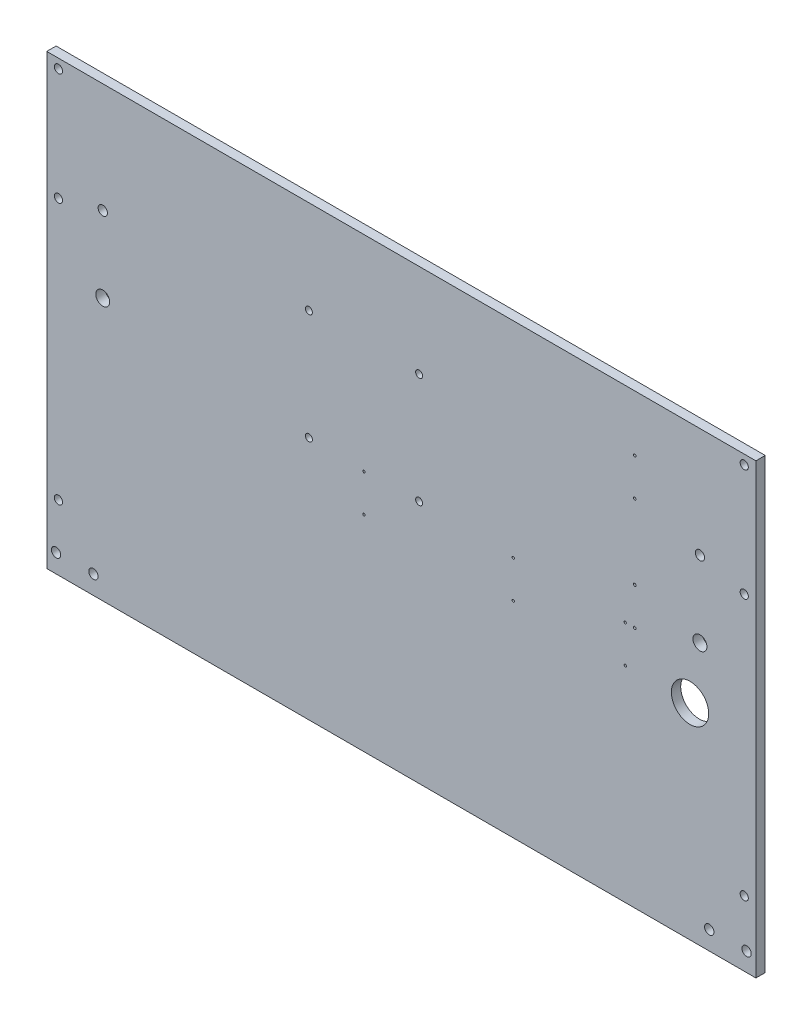
ISO-10303-21;
HEADER;
FILE_DESCRIPTION(('STEP AP214'),'2;1');
FILE_NAME('part.step','',(''),(''),'','','');
FILE_SCHEMA(('AUTOMOTIVE_DESIGN { 1 0 10303 214 1 1 1 1 }'));
ENDSEC;
DATA;
#1=APPLICATION_CONTEXT('core data for automotive mechanical design processes');
#2=APPLICATION_PROTOCOL_DEFINITION('international standard','automotive_design',2000,#1);
#3=PRODUCT_CONTEXT('',#1,'mechanical');
#4=PRODUCT('Part','Part','',(#3));
#5=PRODUCT_RELATED_PRODUCT_CATEGORY('part','',(#4));
#6=PRODUCT_DEFINITION_FORMATION('','',#4);
#7=PRODUCT_DEFINITION_CONTEXT('part definition',#1,'design');
#8=PRODUCT_DEFINITION('design','',#6,#7);
#9=PRODUCT_DEFINITION_SHAPE('','',#8);
#10=(LENGTH_UNIT() NAMED_UNIT(*) SI_UNIT(.MILLI.,.METRE.));
#11=(NAMED_UNIT(*) PLANE_ANGLE_UNIT() SI_UNIT($,.RADIAN.));
#12=(NAMED_UNIT(*) SI_UNIT($,.STERADIAN.) SOLID_ANGLE_UNIT());
#13=UNCERTAINTY_MEASURE_WITH_UNIT(LENGTH_MEASURE(1.E-05),#10,'distance_accuracy_value','');
#14=(GEOMETRIC_REPRESENTATION_CONTEXT(3) GLOBAL_UNCERTAINTY_ASSIGNED_CONTEXT((#13)) GLOBAL_UNIT_ASSIGNED_CONTEXT((#10,
#11,#12)) REPRESENTATION_CONTEXT('',''));
#15=CARTESIAN_POINT('',(0.,0.,0.));
#16=DIRECTION('',(0.,0.,1.));
#17=DIRECTION('',(1.,0.,0.));
#18=AXIS2_PLACEMENT_3D('',#15,#16,#17);
#19=CARTESIAN_POINT('',(241.3,-152.4,6.35));
#20=DIRECTION('',(-1.,0.,0.));
#21=DIRECTION('',(0.,0.,1.));
#22=AXIS2_PLACEMENT_3D('',#19,#20,#21);
#23=PLANE('',#22);
#24=DIRECTION('',(0.,1.,0.));
#25=VECTOR('',#24,1.);
#26=CARTESIAN_POINT('',(241.3,-152.4,0.));
#27=LINE('',#26,#25);
#28=CARTESIAN_POINT('',(241.3,-152.4,0.));
#29=VERTEX_POINT('',#28);
#30=CARTESIAN_POINT('',(241.3,152.4,0.));
#31=VERTEX_POINT('',#30);
#32=EDGE_CURVE('E115',#29,#31,#27,.T.);
#33=ORIENTED_EDGE('',*,*,#32,.T.);
#34=DIRECTION('',(0.,0.,-1.));
#35=VECTOR('',#34,1.);
#36=CARTESIAN_POINT('',(241.3,152.4,6.35));
#37=LINE('',#36,#35);
#38=CARTESIAN_POINT('',(241.3,152.4,6.35));
#39=VERTEX_POINT('',#38);
#40=EDGE_CURVE('E11',#39,#31,#37,.T.);
#41=ORIENTED_EDGE('',*,*,#40,.F.);
#42=DIRECTION('',(0.,1.,0.));
#43=VECTOR('',#42,1.);
#44=CARTESIAN_POINT('',(241.3,-152.4,6.35));
#45=LINE('',#44,#43);
#46=CARTESIAN_POINT('',(241.3,-152.4,6.35));
#47=VERTEX_POINT('',#46);
#48=EDGE_CURVE('E97',#47,#39,#45,.T.);
#49=ORIENTED_EDGE('',*,*,#48,.F.);
#50=DIRECTION('',(0.,0.,-1.));
#51=VECTOR('',#50,1.);
#52=CARTESIAN_POINT('',(241.3,-152.4,6.35));
#53=LINE('',#52,#51);
#54=EDGE_CURVE('E111',#47,#29,#53,.T.);
#55=ORIENTED_EDGE('',*,*,#54,.T.);
#56=EDGE_LOOP('',(#33,#41,#49,#55));
#57=FACE_BOUND('',#56,.T.);
#58=ADVANCED_FACE('F45',(#57),#23,.F.);
#59=CARTESIAN_POINT('',(-241.3,152.4,6.35));
#60=DIRECTION('',(0.,-1.,0.));
#61=DIRECTION('',(0.,0.,-1.));
#62=AXIS2_PLACEMENT_3D('',#59,#60,#61);
#63=PLANE('',#62);
#64=DIRECTION('',(-1.,0.,0.));
#65=VECTOR('',#64,1.);
#66=CARTESIAN_POINT('',(-241.3,152.4,0.));
#67=LINE('',#66,#65);
#68=CARTESIAN_POINT('',(-241.3,152.4,0.));
#69=VERTEX_POINT('',#68);
#70=EDGE_CURVE('E102',#31,#69,#67,.T.);
#71=ORIENTED_EDGE('',*,*,#70,.T.);
#72=DIRECTION('',(0.,0.,-1.));
#73=VECTOR('',#72,1.);
#74=CARTESIAN_POINT('',(-241.3,152.4,6.35));
#75=LINE('',#74,#73);
#76=CARTESIAN_POINT('',(-241.3,152.4,6.35));
#77=VERTEX_POINT('',#76);
#78=EDGE_CURVE('E54',#77,#69,#75,.T.);
#79=ORIENTED_EDGE('',*,*,#78,.F.);
#80=DIRECTION('',(-1.,0.,0.));
#81=VECTOR('',#80,1.);
#82=CARTESIAN_POINT('',(-241.3,152.4,6.35));
#83=LINE('',#82,#81);
#84=EDGE_CURVE('E92',#39,#77,#83,.T.);
#85=ORIENTED_EDGE('',*,*,#84,.F.);
#86=ORIENTED_EDGE('',*,*,#40,.T.);
#87=EDGE_LOOP('',(#71,#79,#85,#86));
#88=FACE_BOUND('',#87,.T.);
#89=ADVANCED_FACE('F101',(#88),#63,.F.);
#90=CARTESIAN_POINT('',(-241.3,-152.4,6.35));
#91=DIRECTION('',(1.,0.,0.));
#92=DIRECTION('',(0.,0.,-1.));
#93=AXIS2_PLACEMENT_3D('',#90,#91,#92);
#94=PLANE('',#93);
#95=DIRECTION('',(0.,-1.,0.));
#96=VECTOR('',#95,1.);
#97=CARTESIAN_POINT('',(-241.3,-152.4,0.));
#98=LINE('',#97,#96);
#99=CARTESIAN_POINT('',(-241.3,-152.4,0.));
#100=VERTEX_POINT('',#99);
#101=EDGE_CURVE('E79',#69,#100,#98,.T.);
#102=ORIENTED_EDGE('',*,*,#101,.T.);
#103=DIRECTION('',(0.,0.,-1.));
#104=VECTOR('',#103,1.);
#105=CARTESIAN_POINT('',(-241.3,-152.4,6.35));
#106=LINE('',#105,#104);
#107=CARTESIAN_POINT('',(-241.3,-152.4,6.35));
#108=VERTEX_POINT('',#107);
#109=EDGE_CURVE('E104',#108,#100,#106,.T.);
#110=ORIENTED_EDGE('',*,*,#109,.F.);
#111=DIRECTION('',(0.,-1.,0.));
#112=VECTOR('',#111,1.);
#113=CARTESIAN_POINT('',(-241.3,-152.4,6.35));
#114=LINE('',#113,#112);
#115=EDGE_CURVE('E95',#77,#108,#114,.T.);
#116=ORIENTED_EDGE('',*,*,#115,.F.);
#117=ORIENTED_EDGE('',*,*,#78,.T.);
#118=EDGE_LOOP('',(#102,#110,#116,#117));
#119=FACE_BOUND('',#118,.T.);
#120=ADVANCED_FACE('F105',(#119),#94,.F.);
#121=CARTESIAN_POINT('',(-241.3,-152.4,6.35));
#122=DIRECTION('',(0.,1.,0.));
#123=DIRECTION('',(0.,0.,1.));
#124=AXIS2_PLACEMENT_3D('',#121,#122,#123);
#125=PLANE('',#124);
#126=DIRECTION('',(1.,0.,0.));
#127=VECTOR('',#126,1.);
#128=CARTESIAN_POINT('',(-241.3,-152.4,0.));
#129=LINE('',#128,#127);
#130=EDGE_CURVE('E85',#100,#29,#129,.T.);
#131=ORIENTED_EDGE('',*,*,#130,.T.);
#132=ORIENTED_EDGE('',*,*,#54,.F.);
#133=DIRECTION('',(1.,0.,0.));
#134=VECTOR('',#133,1.);
#135=CARTESIAN_POINT('',(-241.3,-152.4,6.35));
#136=LINE('',#135,#134);
#137=EDGE_CURVE('E62',#108,#47,#136,.T.);
#138=ORIENTED_EDGE('',*,*,#137,.F.);
#139=ORIENTED_EDGE('',*,*,#109,.T.);
#140=EDGE_LOOP('',(#131,#132,#138,#139));
#141=FACE_BOUND('',#140,.T.);
#142=ADVANCED_FACE('F131',(#141),#125,.F.);
#143=CARTESIAN_POINT('',(0.,0.,6.35));
#144=DIRECTION('',(0.,0.,-1.));
#145=DIRECTION('',(-1.,0.,0.));
#146=AXIS2_PLACEMENT_3D('',#143,#144,#145);
#147=PLANE('',#146);
#148=CARTESIAN_POINT('',(76.2,12.7,6.35));
#149=DIRECTION('',(0.,0.,1.));
#150=DIRECTION('',(1.,0.,0.));
#151=AXIS2_PLACEMENT_3D('',#148,#149,#150);
#152=CIRCLE('',#151,0.793749999999993);
#153=CARTESIAN_POINT('',(76.99375,12.7,6.35));
#154=VERTEX_POINT('',#153);
#155=EDGE_CURVE('E352',#154,#154,#152,.T.);
#156=ORIENTED_EDGE('',*,*,#155,.F.);
#157=EDGE_LOOP('',(#156));
#158=FACE_BOUND('',#157,.T.);
#159=CARTESIAN_POINT('',(152.4,-12.7,6.35));
#160=DIRECTION('',(0.,0.,1.));
#161=DIRECTION('',(1.,0.,0.));
#162=AXIS2_PLACEMENT_3D('',#159,#160,#161);
#163=CIRCLE('',#162,0.793749999999991);
#164=CARTESIAN_POINT('',(153.19375,-12.7,6.35));
#165=VERTEX_POINT('',#164);
#166=EDGE_CURVE('E337',#165,#165,#163,.T.);
#167=ORIENTED_EDGE('',*,*,#166,.F.);
#168=EDGE_LOOP('',(#167));
#169=FACE_BOUND('',#168,.T.);
#170=CARTESIAN_POINT('',(76.2,-12.7,6.35));
#171=DIRECTION('',(0.,0.,1.));
#172=DIRECTION('',(1.,0.,0.));
#173=AXIS2_PLACEMENT_3D('',#170,#171,#172);
#174=CIRCLE('',#173,0.793749999999993);
#175=CARTESIAN_POINT('',(76.99375,-12.7,6.35));
#176=VERTEX_POINT('',#175);
#177=EDGE_CURVE('E336',#176,#176,#174,.T.);
#178=ORIENTED_EDGE('',*,*,#177,.F.);
#179=EDGE_LOOP('',(#178));
#180=FACE_BOUND('',#179,.T.);
#181=CARTESIAN_POINT('',(-25.4,-12.7,6.35));
#182=DIRECTION('',(0.,0.,1.));
#183=DIRECTION('',(1.,0.,0.));
#184=AXIS2_PLACEMENT_3D('',#181,#182,#183);
#185=CIRCLE('',#184,0.8255);
#186=CARTESIAN_POINT('',(-24.5745,-12.7,6.35));
#187=VERTEX_POINT('',#186);
#188=EDGE_CURVE('E328',#187,#187,#185,.T.);
#189=ORIENTED_EDGE('',*,*,#188,.F.);
#190=EDGE_LOOP('',(#189));
#191=FACE_BOUND('',#190,.T.);
#192=CARTESIAN_POINT('',(152.4,12.7,6.35));
#193=DIRECTION('',(0.,0.,1.));
#194=DIRECTION('',(1.,0.,0.));
#195=AXIS2_PLACEMENT_3D('',#192,#193,#194);
#196=CIRCLE('',#195,0.793749999999991);
#197=CARTESIAN_POINT('',(153.19375,12.7,6.35));
#198=VERTEX_POINT('',#197);
#199=EDGE_CURVE('E353',#198,#198,#196,.T.);
#200=ORIENTED_EDGE('',*,*,#199,.F.);
#201=EDGE_LOOP('',(#200));
#202=FACE_BOUND('',#201,.T.);
#203=CARTESIAN_POINT('',(-25.4,12.7,6.35));
#204=DIRECTION('',(0.,0.,1.));
#205=DIRECTION('',(1.,0.,0.));
#206=AXIS2_PLACEMENT_3D('',#203,#204,#205);
#207=CIRCLE('',#206,0.8255);
#208=CARTESIAN_POINT('',(-24.5745,12.7,6.35));
#209=VERTEX_POINT('',#208);
#210=EDGE_CURVE('E324',#209,#209,#207,.T.);
#211=ORIENTED_EDGE('',*,*,#210,.F.);
#212=EDGE_LOOP('',(#211));
#213=FACE_BOUND('',#212,.T.);
#214=CARTESIAN_POINT('',(158.821461805988,114.3,6.35));
#215=DIRECTION('',(0.,0.,1.));
#216=DIRECTION('',(1.,0.,0.));
#217=AXIS2_PLACEMENT_3D('',#214,#215,#216);
#218=CIRCLE('',#217,0.888999999999989);
#219=CARTESIAN_POINT('',(159.710461805988,114.3,6.35));
#220=VERTEX_POINT('',#219);
#221=EDGE_CURVE('E317',#220,#220,#218,.T.);
#222=ORIENTED_EDGE('',*,*,#221,.F.);
#223=EDGE_LOOP('',(#222));
#224=FACE_BOUND('',#223,.T.);
#225=CARTESIAN_POINT('',(158.821461805988,88.9,6.35));
#226=DIRECTION('',(0.,0.,1.));
#227=DIRECTION('',(1.,0.,0.));
#228=AXIS2_PLACEMENT_3D('',#225,#226,#227);
#229=CIRCLE('',#228,0.888999999999989);
#230=CARTESIAN_POINT('',(159.710461805988,88.9,6.35));
#231=VERTEX_POINT('',#230);
#232=EDGE_CURVE('E313',#231,#231,#229,.T.);
#233=ORIENTED_EDGE('',*,*,#232,.F.);
#234=EDGE_LOOP('',(#233));
#235=FACE_BOUND('',#234,.T.);
#236=CARTESIAN_POINT('',(158.821461805988,38.1,6.35));
#237=DIRECTION('',(0.,0.,1.));
#238=DIRECTION('',(1.,0.,0.));
#239=AXIS2_PLACEMENT_3D('',#236,#237,#238);
#240=CIRCLE('',#239,0.888999999999989);
#241=CARTESIAN_POINT('',(159.710461805988,38.1,6.35));
#242=VERTEX_POINT('',#241);
#243=EDGE_CURVE('E305',#242,#242,#240,.T.);
#244=ORIENTED_EDGE('',*,*,#243,.F.);
#245=EDGE_LOOP('',(#244));
#246=FACE_BOUND('',#245,.T.);
#247=CARTESIAN_POINT('',(158.821461805988,12.7,6.35));
#248=DIRECTION('',(0.,0.,1.));
#249=DIRECTION('',(1.,0.,0.));
#250=AXIS2_PLACEMENT_3D('',#247,#248,#249);
#251=CIRCLE('',#250,0.88899999999999);
#252=CARTESIAN_POINT('',(159.710461805988,12.7,6.35));
#253=VERTEX_POINT('',#252);
#254=EDGE_CURVE('E296',#253,#253,#251,.T.);
#255=ORIENTED_EDGE('',*,*,#254,.F.);
#256=EDGE_LOOP('',(#255));
#257=FACE_BOUND('',#256,.T.);
#258=CARTESIAN_POINT('',(-203.2,26.0961059151182,6.35));
#259=DIRECTION('',(0.,0.,1.));
#260=DIRECTION('',(1.,0.,0.));
#261=AXIS2_PLACEMENT_3D('',#258,#259,#260);
#262=CIRCLE('',#261,4.76250000000001);
#263=CARTESIAN_POINT('',(-198.4375,26.0961059151182,6.35));
#264=VERTEX_POINT('',#263);
#265=EDGE_CURVE('E264',#264,#264,#262,.T.);
#266=ORIENTED_EDGE('',*,*,#265,.F.);
#267=EDGE_LOOP('',(#266));
#268=FACE_BOUND('',#267,.T.);
#269=CARTESIAN_POINT('',(203.2,77.727111166535,6.35));
#270=DIRECTION('',(0.,0.,1.));
#271=DIRECTION('',(1.,0.,0.));
#272=AXIS2_PLACEMENT_3D('',#269,#270,#271);
#273=CIRCLE('',#272,3.175);
#274=CARTESIAN_POINT('',(206.375,77.727111166535,6.35));
#275=VERTEX_POINT('',#274);
#276=EDGE_CURVE('E272',#275,#275,#273,.T.);
#277=ORIENTED_EDGE('',*,*,#276,.F.);
#278=EDGE_LOOP('',(#277));
#279=FACE_BOUND('',#278,.T.);
#280=CARTESIAN_POINT('',(203.2,26.0961059151182,6.35));
#281=DIRECTION('',(0.,0.,1.));
#282=DIRECTION('',(1.,0.,0.));
#283=AXIS2_PLACEMENT_3D('',#280,#281,#282);
#284=CIRCLE('',#283,4.76250000000001);
#285=CARTESIAN_POINT('',(207.9625,26.0961059151182,6.35));
#286=VERTEX_POINT('',#285);
#287=EDGE_CURVE('E273',#286,#286,#284,.T.);
#288=ORIENTED_EDGE('',*,*,#287,.F.);
#289=EDGE_LOOP('',(#288));
#290=FACE_BOUND('',#289,.T.);
#291=CARTESIAN_POINT('',(-203.2,77.727111166535,6.35));
#292=DIRECTION('',(0.,0.,1.));
#293=DIRECTION('',(1.,0.,0.));
#294=AXIS2_PLACEMENT_3D('',#291,#292,#293);
#295=CIRCLE('',#294,3.175);
#296=CARTESIAN_POINT('',(-200.025,77.727111166535,6.35));
#297=VERTEX_POINT('',#296);
#298=EDGE_CURVE('E260',#297,#297,#295,.T.);
#299=ORIENTED_EDGE('',*,*,#298,.F.);
#300=EDGE_LOOP('',(#299));
#301=FACE_BOUND('',#300,.T.);
#302=CARTESIAN_POINT('',(-62.9,88.9,6.35));
#303=DIRECTION('',(0.,0.,1.));
#304=DIRECTION('',(1.,0.,0.));
#305=AXIS2_PLACEMENT_3D('',#302,#303,#304);
#306=CIRCLE('',#305,2.3749);
#307=CARTESIAN_POINT('',(-60.5251,88.9,6.35));
#308=VERTEX_POINT('',#307);
#309=EDGE_CURVE('E240',#308,#308,#306,.T.);
#310=ORIENTED_EDGE('',*,*,#309,.F.);
#311=EDGE_LOOP('',(#310));
#312=FACE_BOUND('',#311,.T.);
#313=CARTESIAN_POINT('',(-62.9,13.9,6.35));
#314=DIRECTION('',(0.,0.,1.));
#315=DIRECTION('',(1.,0.,0.));
#316=AXIS2_PLACEMENT_3D('',#313,#314,#315);
#317=CIRCLE('',#316,2.3749);
#318=CARTESIAN_POINT('',(-60.5251,13.9,6.35));
#319=VERTEX_POINT('',#318);
#320=EDGE_CURVE('E249',#319,#319,#317,.T.);
#321=ORIENTED_EDGE('',*,*,#320,.F.);
#322=EDGE_LOOP('',(#321));
#323=FACE_BOUND('',#322,.T.);
#324=CARTESIAN_POINT('',(12.1,13.9,6.35));
#325=DIRECTION('',(0.,0.,1.));
#326=DIRECTION('',(1.,0.,0.));
#327=AXIS2_PLACEMENT_3D('',#324,#325,#326);
#328=CIRCLE('',#327,2.3749);
#329=CARTESIAN_POINT('',(14.4749,13.9,6.35));
#330=VERTEX_POINT('',#329);
#331=EDGE_CURVE('E232',#330,#330,#328,.T.);
#332=ORIENTED_EDGE('',*,*,#331,.F.);
#333=EDGE_LOOP('',(#332));
#334=FACE_BOUND('',#333,.T.);
#335=CARTESIAN_POINT('',(12.1,88.9,6.35));
#336=DIRECTION('',(0.,0.,1.));
#337=DIRECTION('',(1.,0.,0.));
#338=AXIS2_PLACEMENT_3D('',#335,#336,#337);
#339=CIRCLE('',#338,2.37489999999999);
#340=CARTESIAN_POINT('',(14.4749,88.9,6.35));
#341=VERTEX_POINT('',#340);
#342=EDGE_CURVE('E228',#341,#341,#339,.T.);
#343=ORIENTED_EDGE('',*,*,#342,.F.);
#344=EDGE_LOOP('',(#343));
#345=FACE_BOUND('',#344,.T.);
#346=CARTESIAN_POINT('',(196.469,-12.7,6.35));
#347=DIRECTION('',(0.,0.,1.));
#348=DIRECTION('',(1.,0.,0.));
#349=AXIS2_PLACEMENT_3D('',#346,#347,#348);
#350=CIRCLE('',#349,12.7);
#351=CARTESIAN_POINT('',(209.169,-12.7,6.35));
#352=VERTEX_POINT('',#351);
#353=EDGE_CURVE('E220',#352,#352,#350,.T.);
#354=ORIENTED_EDGE('',*,*,#353,.F.);
#355=EDGE_LOOP('',(#354));
#356=FACE_BOUND('',#355,.T.);
#357=CARTESIAN_POINT('',(234.95,-139.7,6.35));
#358=DIRECTION('',(0.,0.,-1.));
#359=DIRECTION('',(-1.,0.,0.));
#360=AXIS2_PLACEMENT_3D('',#357,#358,#359);
#361=CIRCLE('',#360,3.175);
#362=CARTESIAN_POINT('',(231.775,-139.7,6.35));
#363=VERTEX_POINT('',#362);
#364=EDGE_CURVE('E213',#363,#363,#361,.T.);
#365=ORIENTED_EDGE('',*,*,#364,.T.);
#366=EDGE_LOOP('',(#365));
#367=FACE_BOUND('',#366,.T.);
#368=CARTESIAN_POINT('',(209.55,-139.7,6.35));
#369=DIRECTION('',(0.,0.,-1.));
#370=DIRECTION('',(-1.,0.,0.));
#371=AXIS2_PLACEMENT_3D('',#368,#369,#370);
#372=CIRCLE('',#371,3.17499999999997);
#373=CARTESIAN_POINT('',(206.375,-139.7,6.35));
#374=VERTEX_POINT('',#373);
#375=EDGE_CURVE('E204',#374,#374,#372,.T.);
#376=ORIENTED_EDGE('',*,*,#375,.T.);
#377=EDGE_LOOP('',(#376));
#378=FACE_BOUND('',#377,.T.);
#379=CARTESIAN_POINT('',(-234.95,-139.7,6.35));
#380=DIRECTION('',(0.,0.,1.));
#381=DIRECTION('',(1.,0.,0.));
#382=AXIS2_PLACEMENT_3D('',#379,#380,#381);
#383=CIRCLE('',#382,3.175);
#384=CARTESIAN_POINT('',(-231.775,-139.7,6.35));
#385=VERTEX_POINT('',#384);
#386=EDGE_CURVE('E197',#385,#385,#383,.T.);
#387=ORIENTED_EDGE('',*,*,#386,.F.);
#388=EDGE_LOOP('',(#387));
#389=FACE_BOUND('',#388,.T.);
#390=CARTESIAN_POINT('',(-209.55,-139.7,6.35));
#391=DIRECTION('',(0.,0.,1.));
#392=DIRECTION('',(1.,0.,0.));
#393=AXIS2_PLACEMENT_3D('',#390,#391,#392);
#394=CIRCLE('',#393,3.17499999999997);
#395=CARTESIAN_POINT('',(-206.375,-139.7,6.35));
#396=VERTEX_POINT('',#395);
#397=EDGE_CURVE('E192',#396,#396,#394,.T.);
#398=ORIENTED_EDGE('',*,*,#397,.F.);
#399=EDGE_LOOP('',(#398));
#400=FACE_BOUND('',#399,.T.);
#401=CARTESIAN_POINT('',(233.3498,146.05,6.35));
#402=DIRECTION('',(0.,0.,-1.));
#403=DIRECTION('',(-1.,0.,0.));
#404=AXIS2_PLACEMENT_3D('',#401,#402,#403);
#405=CIRCLE('',#404,2.78129999999998);
#406=CARTESIAN_POINT('',(230.5685,146.05,6.35));
#407=VERTEX_POINT('',#406);
#408=EDGE_CURVE('E181',#407,#407,#405,.T.);
#409=ORIENTED_EDGE('',*,*,#408,.T.);
#410=EDGE_LOOP('',(#409));
#411=FACE_BOUND('',#410,.T.);
#412=CARTESIAN_POINT('',(233.3498,-107.95,6.35));
#413=DIRECTION('',(0.,0.,-1.));
#414=DIRECTION('',(-1.,0.,0.));
#415=AXIS2_PLACEMENT_3D('',#412,#413,#414);
#416=CIRCLE('',#415,2.78130000000001);
#417=CARTESIAN_POINT('',(230.5685,-107.95,6.35));
#418=VERTEX_POINT('',#417);
#419=EDGE_CURVE('E173',#418,#418,#416,.T.);
#420=ORIENTED_EDGE('',*,*,#419,.T.);
#421=EDGE_LOOP('',(#420));
#422=FACE_BOUND('',#421,.T.);
#423=CARTESIAN_POINT('',(233.3498,69.85,6.35));
#424=DIRECTION('',(0.,0.,-1.));
#425=DIRECTION('',(-1.,0.,0.));
#426=AXIS2_PLACEMENT_3D('',#423,#424,#425);
#427=CIRCLE('',#426,2.78129999999998);
#428=CARTESIAN_POINT('',(230.5685,69.85,6.35));
#429=VERTEX_POINT('',#428);
#430=EDGE_CURVE('E164',#429,#429,#427,.T.);
#431=ORIENTED_EDGE('',*,*,#430,.T.);
#432=EDGE_LOOP('',(#431));
#433=FACE_BOUND('',#432,.T.);
#434=CARTESIAN_POINT('',(-233.3498,146.05,6.35));
#435=DIRECTION('',(0.,0.,1.));
#436=DIRECTION('',(1.,0.,0.));
#437=AXIS2_PLACEMENT_3D('',#434,#435,#436);
#438=CIRCLE('',#437,2.78129999999998);
#439=CARTESIAN_POINT('',(-230.5685,146.05,6.35));
#440=VERTEX_POINT('',#439);
#441=EDGE_CURVE('E157',#440,#440,#438,.T.);
#442=ORIENTED_EDGE('',*,*,#441,.F.);
#443=EDGE_LOOP('',(#442));
#444=FACE_BOUND('',#443,.T.);
#445=CARTESIAN_POINT('',(-233.3498,-107.95,6.35));
#446=DIRECTION('',(0.,0.,1.));
#447=DIRECTION('',(1.,0.,0.));
#448=AXIS2_PLACEMENT_3D('',#445,#446,#447);
#449=CIRCLE('',#448,2.78130000000001);
#450=CARTESIAN_POINT('',(-230.5685,-107.95,6.35));
#451=VERTEX_POINT('',#450);
#452=EDGE_CURVE('E153',#451,#451,#449,.T.);
#453=ORIENTED_EDGE('',*,*,#452,.F.);
#454=EDGE_LOOP('',(#453));
#455=FACE_BOUND('',#454,.T.);
#456=CARTESIAN_POINT('',(-233.3498,69.85,6.35));
#457=DIRECTION('',(0.,0.,1.));
#458=DIRECTION('',(1.,0.,0.));
#459=AXIS2_PLACEMENT_3D('',#456,#457,#458);
#460=CIRCLE('',#459,2.78129999999998);
#461=CARTESIAN_POINT('',(-230.5685,69.85,6.35));
#462=VERTEX_POINT('',#461);
#463=EDGE_CURVE('E144',#462,#462,#460,.T.);
#464=ORIENTED_EDGE('',*,*,#463,.F.);
#465=EDGE_LOOP('',(#464));
#466=FACE_BOUND('',#465,.T.);
#467=ORIENTED_EDGE('',*,*,#48,.T.);
#468=ORIENTED_EDGE('',*,*,#84,.T.);
#469=ORIENTED_EDGE('',*,*,#115,.T.);
#470=ORIENTED_EDGE('',*,*,#137,.T.);
#471=EDGE_LOOP('',(#467,#468,#469,#470));
#472=FACE_BOUND('',#471,.T.);
#473=ADVANCED_FACE('F93',(#158,#169,#180,#191,#202,#213,#224,#235,#246,#257,#268,#279,#290,#301,
#312,#323,#334,#345,#356,#367,#378,#389,#400,#411,#422,#433,#444,#455,#466,#472),#147,.F.);
#474=CARTESIAN_POINT('',(0.,0.,0.));
#475=DIRECTION('',(0.,0.,-1.));
#476=DIRECTION('',(-1.,0.,0.));
#477=AXIS2_PLACEMENT_3D('',#474,#475,#476);
#478=PLANE('',#477);
#479=CARTESIAN_POINT('',(76.2,12.7,0.));
#480=DIRECTION('',(0.,0.,1.));
#481=DIRECTION('',(1.,0.,0.));
#482=AXIS2_PLACEMENT_3D('',#479,#480,#481);
#483=CIRCLE('',#482,0.793749999999993);
#484=CARTESIAN_POINT('',(76.99375,12.7,0.));
#485=VERTEX_POINT('',#484);
#486=EDGE_CURVE('E348',#485,#485,#483,.T.);
#487=ORIENTED_EDGE('',*,*,#486,.T.);
#488=EDGE_LOOP('',(#487));
#489=FACE_BOUND('',#488,.T.);
#490=CARTESIAN_POINT('',(152.4,-12.7,0.));
#491=DIRECTION('',(0.,0.,1.));
#492=DIRECTION('',(1.,0.,0.));
#493=AXIS2_PLACEMENT_3D('',#490,#491,#492);
#494=CIRCLE('',#493,0.793749999999991);
#495=CARTESIAN_POINT('',(153.19375,-12.7,0.));
#496=VERTEX_POINT('',#495);
#497=EDGE_CURVE('E357',#496,#496,#494,.T.);
#498=ORIENTED_EDGE('',*,*,#497,.T.);
#499=EDGE_LOOP('',(#498));
#500=FACE_BOUND('',#499,.T.);
#501=CARTESIAN_POINT('',(76.2,-12.7,0.));
#502=DIRECTION('',(0.,0.,1.));
#503=DIRECTION('',(1.,0.,0.));
#504=AXIS2_PLACEMENT_3D('',#501,#502,#503);
#505=CIRCLE('',#504,0.793749999999993);
#506=CARTESIAN_POINT('',(76.99375,-12.7,0.));
#507=VERTEX_POINT('',#506);
#508=EDGE_CURVE('E332',#507,#507,#505,.T.);
#509=ORIENTED_EDGE('',*,*,#508,.T.);
#510=EDGE_LOOP('',(#509));
#511=FACE_BOUND('',#510,.T.);
#512=CARTESIAN_POINT('',(-25.4,-12.7,0.));
#513=DIRECTION('',(0.,0.,1.));
#514=DIRECTION('',(1.,0.,0.));
#515=AXIS2_PLACEMENT_3D('',#512,#513,#514);
#516=CIRCLE('',#515,0.8255);
#517=CARTESIAN_POINT('',(-24.5745,-12.7,0.));
#518=VERTEX_POINT('',#517);
#519=EDGE_CURVE('E341',#518,#518,#516,.T.);
#520=ORIENTED_EDGE('',*,*,#519,.T.);
#521=EDGE_LOOP('',(#520));
#522=FACE_BOUND('',#521,.T.);
#523=CARTESIAN_POINT('',(152.4,12.7,0.));
#524=DIRECTION('',(0.,0.,1.));
#525=DIRECTION('',(1.,0.,0.));
#526=AXIS2_PLACEMENT_3D('',#523,#524,#525);
#527=CIRCLE('',#526,0.793749999999991);
#528=CARTESIAN_POINT('',(153.19375,12.7,0.));
#529=VERTEX_POINT('',#528);
#530=EDGE_CURVE('E364',#529,#529,#527,.T.);
#531=ORIENTED_EDGE('',*,*,#530,.T.);
#532=EDGE_LOOP('',(#531));
#533=FACE_BOUND('',#532,.T.);
#534=CARTESIAN_POINT('',(-25.4,12.7,0.));
#535=DIRECTION('',(0.,0.,1.));
#536=DIRECTION('',(1.,0.,0.));
#537=AXIS2_PLACEMENT_3D('',#534,#535,#536);
#538=CIRCLE('',#537,0.8255);
#539=CARTESIAN_POINT('',(-24.5745,12.7,0.));
#540=VERTEX_POINT('',#539);
#541=EDGE_CURVE('E297',#540,#540,#538,.T.);
#542=ORIENTED_EDGE('',*,*,#541,.T.);
#543=EDGE_LOOP('',(#542));
#544=FACE_BOUND('',#543,.T.);
#545=CARTESIAN_POINT('',(158.821461805988,114.3,0.));
#546=DIRECTION('',(0.,0.,1.));
#547=DIRECTION('',(1.,0.,0.));
#548=AXIS2_PLACEMENT_3D('',#545,#546,#547);
#549=CIRCLE('',#548,0.888999999999989);
#550=CARTESIAN_POINT('',(159.710461805988,114.3,0.));
#551=VERTEX_POINT('',#550);
#552=EDGE_CURVE('E288',#551,#551,#549,.T.);
#553=ORIENTED_EDGE('',*,*,#552,.T.);
#554=EDGE_LOOP('',(#553));
#555=FACE_BOUND('',#554,.T.);
#556=CARTESIAN_POINT('',(158.821461805988,88.9,0.));
#557=DIRECTION('',(0.,0.,1.));
#558=DIRECTION('',(1.,0.,0.));
#559=AXIS2_PLACEMENT_3D('',#556,#557,#558);
#560=CIRCLE('',#559,0.888999999999989);
#561=CARTESIAN_POINT('',(159.710461805988,88.9,0.));
#562=VERTEX_POINT('',#561);
#563=EDGE_CURVE('E309',#562,#562,#560,.T.);
#564=ORIENTED_EDGE('',*,*,#563,.T.);
#565=EDGE_LOOP('',(#564));
#566=FACE_BOUND('',#565,.T.);
#567=CARTESIAN_POINT('',(158.821461805988,38.1,0.));
#568=DIRECTION('',(0.,0.,1.));
#569=DIRECTION('',(1.,0.,0.));
#570=AXIS2_PLACEMENT_3D('',#567,#568,#569);
#571=CIRCLE('',#570,0.888999999999989);
#572=CARTESIAN_POINT('',(159.710461805988,38.1,0.));
#573=VERTEX_POINT('',#572);
#574=EDGE_CURVE('E301',#573,#573,#571,.T.);
#575=ORIENTED_EDGE('',*,*,#574,.T.);
#576=EDGE_LOOP('',(#575));
#577=FACE_BOUND('',#576,.T.);
#578=CARTESIAN_POINT('',(158.821461805988,12.7,0.));
#579=DIRECTION('',(0.,0.,1.));
#580=DIRECTION('',(1.,0.,0.));
#581=AXIS2_PLACEMENT_3D('',#578,#579,#580);
#582=CIRCLE('',#581,0.88899999999999);
#583=CARTESIAN_POINT('',(159.710461805988,12.7,0.));
#584=VERTEX_POINT('',#583);
#585=EDGE_CURVE('E292',#584,#584,#582,.T.);
#586=ORIENTED_EDGE('',*,*,#585,.T.);
#587=EDGE_LOOP('',(#586));
#588=FACE_BOUND('',#587,.T.);
#589=CARTESIAN_POINT('',(-203.2,26.0961059151182,0.));
#590=DIRECTION('',(0.,0.,1.));
#591=DIRECTION('',(1.,0.,0.));
#592=AXIS2_PLACEMENT_3D('',#589,#590,#591);
#593=CIRCLE('',#592,4.76250000000001);
#594=CARTESIAN_POINT('',(-198.4375,26.0961059151182,0.));
#595=VERTEX_POINT('',#594);
#596=EDGE_CURVE('E277',#595,#595,#593,.T.);
#597=ORIENTED_EDGE('',*,*,#596,.T.);
#598=EDGE_LOOP('',(#597));
#599=FACE_BOUND('',#598,.T.);
#600=CARTESIAN_POINT('',(203.2,77.727111166535,0.));
#601=DIRECTION('',(0.,0.,1.));
#602=DIRECTION('',(1.,0.,0.));
#603=AXIS2_PLACEMENT_3D('',#600,#601,#602);
#604=CIRCLE('',#603,3.175);
#605=CARTESIAN_POINT('',(206.375,77.727111166535,0.));
#606=VERTEX_POINT('',#605);
#607=EDGE_CURVE('E268',#606,#606,#604,.T.);
#608=ORIENTED_EDGE('',*,*,#607,.T.);
#609=EDGE_LOOP('',(#608));
#610=FACE_BOUND('',#609,.T.);
#611=CARTESIAN_POINT('',(203.2,26.0961059151182,0.));
#612=DIRECTION('',(0.,0.,1.));
#613=DIRECTION('',(1.,0.,0.));
#614=AXIS2_PLACEMENT_3D('',#611,#612,#613);
#615=CIRCLE('',#614,4.76250000000001);
#616=CARTESIAN_POINT('',(207.9625,26.0961059151182,0.));
#617=VERTEX_POINT('',#616);
#618=EDGE_CURVE('E284',#617,#617,#615,.T.);
#619=ORIENTED_EDGE('',*,*,#618,.T.);
#620=EDGE_LOOP('',(#619));
#621=FACE_BOUND('',#620,.T.);
#622=CARTESIAN_POINT('',(-203.2,77.727111166535,0.));
#623=DIRECTION('',(0.,0.,1.));
#624=DIRECTION('',(1.,0.,0.));
#625=AXIS2_PLACEMENT_3D('',#622,#623,#624);
#626=CIRCLE('',#625,3.175);
#627=CARTESIAN_POINT('',(-200.025,77.727111166535,0.));
#628=VERTEX_POINT('',#627);
#629=EDGE_CURVE('E241',#628,#628,#626,.T.);
#630=ORIENTED_EDGE('',*,*,#629,.T.);
#631=EDGE_LOOP('',(#630));
#632=FACE_BOUND('',#631,.T.);
#633=CARTESIAN_POINT('',(-62.9,88.9,0.));
#634=DIRECTION('',(0.,0.,1.));
#635=DIRECTION('',(1.,0.,0.));
#636=AXIS2_PLACEMENT_3D('',#633,#634,#635);
#637=CIRCLE('',#636,2.3749);
#638=CARTESIAN_POINT('',(-60.5251,88.9,0.));
#639=VERTEX_POINT('',#638);
#640=EDGE_CURVE('E236',#639,#639,#637,.T.);
#641=ORIENTED_EDGE('',*,*,#640,.T.);
#642=EDGE_LOOP('',(#641));
#643=FACE_BOUND('',#642,.T.);
#644=CARTESIAN_POINT('',(-62.9,13.9,0.));
#645=DIRECTION('',(0.,0.,1.));
#646=DIRECTION('',(1.,0.,0.));
#647=AXIS2_PLACEMENT_3D('',#644,#645,#646);
#648=CIRCLE('',#647,2.3749);
#649=CARTESIAN_POINT('',(-60.5251,13.9,0.));
#650=VERTEX_POINT('',#649);
#651=EDGE_CURVE('E245',#650,#650,#648,.T.);
#652=ORIENTED_EDGE('',*,*,#651,.T.);
#653=EDGE_LOOP('',(#652));
#654=FACE_BOUND('',#653,.T.);
#655=CARTESIAN_POINT('',(12.1,13.9,0.));
#656=DIRECTION('',(0.,0.,1.));
#657=DIRECTION('',(1.,0.,0.));
#658=AXIS2_PLACEMENT_3D('',#655,#656,#657);
#659=CIRCLE('',#658,2.3749);
#660=CARTESIAN_POINT('',(14.4749,13.9,0.));
#661=VERTEX_POINT('',#660);
#662=EDGE_CURVE('E253',#661,#661,#659,.T.);
#663=ORIENTED_EDGE('',*,*,#662,.T.);
#664=EDGE_LOOP('',(#663));
#665=FACE_BOUND('',#664,.T.);
#666=CARTESIAN_POINT('',(12.1,88.9,0.));
#667=DIRECTION('',(0.,0.,1.));
#668=DIRECTION('',(1.,0.,0.));
#669=AXIS2_PLACEMENT_3D('',#666,#667,#668);
#670=CIRCLE('',#669,2.37489999999999);
#671=CARTESIAN_POINT('',(14.4749,88.9,0.));
#672=VERTEX_POINT('',#671);
#673=EDGE_CURVE('E224',#672,#672,#670,.T.);
#674=ORIENTED_EDGE('',*,*,#673,.T.);
#675=EDGE_LOOP('',(#674));
#676=FACE_BOUND('',#675,.T.);
#677=CARTESIAN_POINT('',(196.469,-12.7,0.));
#678=DIRECTION('',(0.,0.,1.));
#679=DIRECTION('',(1.,0.,0.));
#680=AXIS2_PLACEMENT_3D('',#677,#678,#679);
#681=CIRCLE('',#680,12.7);
#682=CARTESIAN_POINT('',(209.169,-12.7,0.));
#683=VERTEX_POINT('',#682);
#684=EDGE_CURVE('E209',#683,#683,#681,.T.);
#685=ORIENTED_EDGE('',*,*,#684,.T.);
#686=EDGE_LOOP('',(#685));
#687=FACE_BOUND('',#686,.T.);
#688=CARTESIAN_POINT('',(234.95,-139.7,0.));
#689=DIRECTION('',(0.,0.,-1.));
#690=DIRECTION('',(-1.,0.,0.));
#691=AXIS2_PLACEMENT_3D('',#688,#689,#690);
#692=CIRCLE('',#691,3.175);
#693=CARTESIAN_POINT('',(231.775,-139.7,0.));
#694=VERTEX_POINT('',#693);
#695=EDGE_CURVE('E193',#694,#694,#692,.T.);
#696=ORIENTED_EDGE('',*,*,#695,.F.);
#697=EDGE_LOOP('',(#696));
#698=FACE_BOUND('',#697,.T.);
#699=CARTESIAN_POINT('',(209.55,-139.7,0.));
#700=DIRECTION('',(0.,0.,-1.));
#701=DIRECTION('',(-1.,0.,0.));
#702=AXIS2_PLACEMENT_3D('',#699,#700,#701);
#703=CIRCLE('',#702,3.17499999999997);
#704=CARTESIAN_POINT('',(206.375,-139.7,0.));
#705=VERTEX_POINT('',#704);
#706=EDGE_CURVE('E208',#705,#705,#703,.T.);
#707=ORIENTED_EDGE('',*,*,#706,.F.);
#708=EDGE_LOOP('',(#707));
#709=FACE_BOUND('',#708,.T.);
#710=CARTESIAN_POINT('',(-234.95,-139.7,0.));
#711=DIRECTION('',(0.,0.,1.));
#712=DIRECTION('',(1.,0.,0.));
#713=AXIS2_PLACEMENT_3D('',#710,#711,#712);
#714=CIRCLE('',#713,3.175);
#715=CARTESIAN_POINT('',(-231.775,-139.7,0.));
#716=VERTEX_POINT('',#715);
#717=EDGE_CURVE('E169',#716,#716,#714,.T.);
#718=ORIENTED_EDGE('',*,*,#717,.T.);
#719=EDGE_LOOP('',(#718));
#720=FACE_BOUND('',#719,.T.);
#721=CARTESIAN_POINT('',(-209.55,-139.7,0.));
#722=DIRECTION('',(0.,0.,1.));
#723=DIRECTION('',(1.,0.,0.));
#724=AXIS2_PLACEMENT_3D('',#721,#722,#723);
#725=CIRCLE('',#724,3.17499999999997);
#726=CARTESIAN_POINT('',(-206.375,-139.7,0.));
#727=VERTEX_POINT('',#726);
#728=EDGE_CURVE('E188',#727,#727,#725,.T.);
#729=ORIENTED_EDGE('',*,*,#728,.T.);
#730=EDGE_LOOP('',(#729));
#731=FACE_BOUND('',#730,.T.);
#732=CARTESIAN_POINT('',(233.3498,146.05,0.));
#733=DIRECTION('',(0.,0.,-1.));
#734=DIRECTION('',(-1.,0.,0.));
#735=AXIS2_PLACEMENT_3D('',#732,#733,#734);
#736=CIRCLE('',#735,2.78129999999998);
#737=CARTESIAN_POINT('',(230.5685,146.05,0.));
#738=VERTEX_POINT('',#737);
#739=EDGE_CURVE('E145',#738,#738,#736,.T.);
#740=ORIENTED_EDGE('',*,*,#739,.F.);
#741=EDGE_LOOP('',(#740));
#742=FACE_BOUND('',#741,.T.);
#743=CARTESIAN_POINT('',(233.3498,-107.95,0.));
#744=DIRECTION('',(0.,0.,-1.));
#745=DIRECTION('',(-1.,0.,0.));
#746=AXIS2_PLACEMENT_3D('',#743,#744,#745);
#747=CIRCLE('',#746,2.78130000000001);
#748=CARTESIAN_POINT('',(230.5685,-107.95,0.));
#749=VERTEX_POINT('',#748);
#750=EDGE_CURVE('E177',#749,#749,#747,.T.);
#751=ORIENTED_EDGE('',*,*,#750,.F.);
#752=EDGE_LOOP('',(#751));
#753=FACE_BOUND('',#752,.T.);
#754=CARTESIAN_POINT('',(233.3498,69.85,0.));
#755=DIRECTION('',(0.,0.,-1.));
#756=DIRECTION('',(-1.,0.,0.));
#757=AXIS2_PLACEMENT_3D('',#754,#755,#756);
#758=CIRCLE('',#757,2.78129999999998);
#759=CARTESIAN_POINT('',(230.5685,69.85,0.));
#760=VERTEX_POINT('',#759);
#761=EDGE_CURVE('E168',#760,#760,#758,.T.);
#762=ORIENTED_EDGE('',*,*,#761,.F.);
#763=EDGE_LOOP('',(#762));
#764=FACE_BOUND('',#763,.T.);
#765=CARTESIAN_POINT('',(-233.3498,146.05,0.));
#766=DIRECTION('',(0.,0.,1.));
#767=DIRECTION('',(1.,0.,0.));
#768=AXIS2_PLACEMENT_3D('',#765,#766,#767);
#769=CIRCLE('',#768,2.78129999999998);
#770=CARTESIAN_POINT('',(-230.5685,146.05,0.));
#771=VERTEX_POINT('',#770);
#772=EDGE_CURVE('E119',#771,#771,#769,.T.);
#773=ORIENTED_EDGE('',*,*,#772,.T.);
#774=EDGE_LOOP('',(#773));
#775=FACE_BOUND('',#774,.T.);
#776=CARTESIAN_POINT('',(-233.3498,-107.95,0.));
#777=DIRECTION('',(0.,0.,1.));
#778=DIRECTION('',(1.,0.,0.));
#779=AXIS2_PLACEMENT_3D('',#776,#777,#778);
#780=CIRCLE('',#779,2.78130000000001);
#781=CARTESIAN_POINT('',(-230.5685,-107.95,0.));
#782=VERTEX_POINT('',#781);
#783=EDGE_CURVE('E149',#782,#782,#780,.T.);
#784=ORIENTED_EDGE('',*,*,#783,.T.);
#785=EDGE_LOOP('',(#784));
#786=FACE_BOUND('',#785,.T.);
#787=CARTESIAN_POINT('',(-233.3498,69.85,0.));
#788=DIRECTION('',(0.,0.,1.));
#789=DIRECTION('',(1.,0.,0.));
#790=AXIS2_PLACEMENT_3D('',#787,#788,#789);
#791=CIRCLE('',#790,2.78129999999998);
#792=CARTESIAN_POINT('',(-230.5685,69.85,0.));
#793=VERTEX_POINT('',#792);
#794=EDGE_CURVE('E140',#793,#793,#791,.T.);
#795=ORIENTED_EDGE('',*,*,#794,.T.);
#796=EDGE_LOOP('',(#795));
#797=FACE_BOUND('',#796,.T.);
#798=ORIENTED_EDGE('',*,*,#32,.F.);
#799=ORIENTED_EDGE('',*,*,#130,.F.);
#800=ORIENTED_EDGE('',*,*,#101,.F.);
#801=ORIENTED_EDGE('',*,*,#70,.F.);
#802=EDGE_LOOP('',(#798,#799,#800,#801));
#803=FACE_BOUND('',#802,.T.);
#804=ADVANCED_FACE('F134',(#489,#500,#511,#522,#533,#544,#555,#566,#577,#588,#599,#610,#621,
#632,#643,#654,#665,#676,#687,#698,#709,#720,#731,#742,#753,#764,#775,#786,#797,#803),#478,.T.);
#805=CARTESIAN_POINT('',(-233.3498,69.85,0.));
#806=DIRECTION('',(0.,0.,1.));
#807=DIRECTION('',(1.,0.,0.));
#808=AXIS2_PLACEMENT_3D('',#805,#806,#807);
#809=CYLINDRICAL_SURFACE('',#808,2.78129999999998);
#810=ORIENTED_EDGE('',*,*,#794,.F.);
#811=EDGE_LOOP('',(#810));
#812=FACE_BOUND('',#811,.T.);
#813=ORIENTED_EDGE('',*,*,#463,.T.);
#814=EDGE_LOOP('',(#813));
#815=FACE_BOUND('',#814,.T.);
#816=ADVANCED_FACE('F428',(#812,#815),#809,.F.);
#817=CARTESIAN_POINT('',(-233.3498,-107.95,0.));
#818=DIRECTION('',(0.,0.,1.));
#819=DIRECTION('',(1.,0.,0.));
#820=AXIS2_PLACEMENT_3D('',#817,#818,#819);
#821=CYLINDRICAL_SURFACE('',#820,2.78130000000001);
#822=ORIENTED_EDGE('',*,*,#783,.F.);
#823=EDGE_LOOP('',(#822));
#824=FACE_BOUND('',#823,.T.);
#825=ORIENTED_EDGE('',*,*,#452,.T.);
#826=EDGE_LOOP('',(#825));
#827=FACE_BOUND('',#826,.T.);
#828=ADVANCED_FACE('F430',(#824,#827),#821,.F.);
#829=CARTESIAN_POINT('',(-233.3498,146.05,0.));
#830=DIRECTION('',(0.,0.,1.));
#831=DIRECTION('',(1.,0.,0.));
#832=AXIS2_PLACEMENT_3D('',#829,#830,#831);
#833=CYLINDRICAL_SURFACE('',#832,2.78129999999998);
#834=ORIENTED_EDGE('',*,*,#772,.F.);
#835=EDGE_LOOP('',(#834));
#836=FACE_BOUND('',#835,.T.);
#837=ORIENTED_EDGE('',*,*,#441,.T.);
#838=EDGE_LOOP('',(#837));
#839=FACE_BOUND('',#838,.T.);
#840=ADVANCED_FACE('F437',(#836,#839),#833,.F.);
#841=CARTESIAN_POINT('',(233.3498,69.85,0.));
#842=DIRECTION('',(0.,0.,1.));
#843=DIRECTION('',(1.,0.,0.));
#844=AXIS2_PLACEMENT_3D('',#841,#842,#843);
#845=CYLINDRICAL_SURFACE('',#844,2.78129999999998);
#846=ORIENTED_EDGE('',*,*,#761,.T.);
#847=EDGE_LOOP('',(#846));
#848=FACE_BOUND('',#847,.T.);
#849=ORIENTED_EDGE('',*,*,#430,.F.);
#850=EDGE_LOOP('',(#849));
#851=FACE_BOUND('',#850,.T.);
#852=ADVANCED_FACE('F728',(#848,#851),#845,.F.);
#853=CARTESIAN_POINT('',(233.3498,-107.95,0.));
#854=DIRECTION('',(0.,0.,1.));
#855=DIRECTION('',(1.,0.,0.));
#856=AXIS2_PLACEMENT_3D('',#853,#854,#855);
#857=CYLINDRICAL_SURFACE('',#856,2.78130000000001);
#858=ORIENTED_EDGE('',*,*,#750,.T.);
#859=EDGE_LOOP('',(#858));
#860=FACE_BOUND('',#859,.T.);
#861=ORIENTED_EDGE('',*,*,#419,.F.);
#862=EDGE_LOOP('',(#861));
#863=FACE_BOUND('',#862,.T.);
#864=ADVANCED_FACE('F718',(#860,#863),#857,.F.);
#865=CARTESIAN_POINT('',(233.3498,146.05,0.));
#866=DIRECTION('',(0.,0.,1.));
#867=DIRECTION('',(1.,0.,0.));
#868=AXIS2_PLACEMENT_3D('',#865,#866,#867);
#869=CYLINDRICAL_SURFACE('',#868,2.78129999999998);
#870=ORIENTED_EDGE('',*,*,#739,.T.);
#871=EDGE_LOOP('',(#870));
#872=FACE_BOUND('',#871,.T.);
#873=ORIENTED_EDGE('',*,*,#408,.F.);
#874=EDGE_LOOP('',(#873));
#875=FACE_BOUND('',#874,.T.);
#876=ADVANCED_FACE('F708',(#872,#875),#869,.F.);
#877=CARTESIAN_POINT('',(-209.55,-139.7,0.));
#878=DIRECTION('',(0.,0.,1.));
#879=DIRECTION('',(1.,0.,0.));
#880=AXIS2_PLACEMENT_3D('',#877,#878,#879);
#881=CYLINDRICAL_SURFACE('',#880,3.17499999999997);
#882=ORIENTED_EDGE('',*,*,#728,.F.);
#883=EDGE_LOOP('',(#882));
#884=FACE_BOUND('',#883,.T.);
#885=ORIENTED_EDGE('',*,*,#397,.T.);
#886=EDGE_LOOP('',(#885));
#887=FACE_BOUND('',#886,.T.);
#888=ADVANCED_FACE('F698',(#884,#887),#881,.F.);
#889=CARTESIAN_POINT('',(-234.95,-139.7,0.));
#890=DIRECTION('',(0.,0.,1.));
#891=DIRECTION('',(1.,0.,0.));
#892=AXIS2_PLACEMENT_3D('',#889,#890,#891);
#893=CYLINDRICAL_SURFACE('',#892,3.175);
#894=ORIENTED_EDGE('',*,*,#717,.F.);
#895=EDGE_LOOP('',(#894));
#896=FACE_BOUND('',#895,.T.);
#897=ORIENTED_EDGE('',*,*,#386,.T.);
#898=EDGE_LOOP('',(#897));
#899=FACE_BOUND('',#898,.T.);
#900=ADVANCED_FACE('F688',(#896,#899),#893,.F.);
#901=CARTESIAN_POINT('',(209.55,-139.7,0.));
#902=DIRECTION('',(0.,0.,1.));
#903=DIRECTION('',(1.,0.,0.));
#904=AXIS2_PLACEMENT_3D('',#901,#902,#903);
#905=CYLINDRICAL_SURFACE('',#904,3.17499999999997);
#906=ORIENTED_EDGE('',*,*,#706,.T.);
#907=EDGE_LOOP('',(#906));
#908=FACE_BOUND('',#907,.T.);
#909=ORIENTED_EDGE('',*,*,#375,.F.);
#910=EDGE_LOOP('',(#909));
#911=FACE_BOUND('',#910,.T.);
#912=ADVANCED_FACE('F678',(#908,#911),#905,.F.);
#913=CARTESIAN_POINT('',(234.95,-139.7,0.));
#914=DIRECTION('',(0.,0.,1.));
#915=DIRECTION('',(1.,0.,0.));
#916=AXIS2_PLACEMENT_3D('',#913,#914,#915);
#917=CYLINDRICAL_SURFACE('',#916,3.175);
#918=ORIENTED_EDGE('',*,*,#695,.T.);
#919=EDGE_LOOP('',(#918));
#920=FACE_BOUND('',#919,.T.);
#921=ORIENTED_EDGE('',*,*,#364,.F.);
#922=EDGE_LOOP('',(#921));
#923=FACE_BOUND('',#922,.T.);
#924=ADVANCED_FACE('F668',(#920,#923),#917,.F.);
#925=CARTESIAN_POINT('',(196.469,-12.7,0.));
#926=DIRECTION('',(0.,0.,1.));
#927=DIRECTION('',(1.,0.,0.));
#928=AXIS2_PLACEMENT_3D('',#925,#926,#927);
#929=CYLINDRICAL_SURFACE('',#928,12.7);
#930=ORIENTED_EDGE('',*,*,#684,.F.);
#931=EDGE_LOOP('',(#930));
#932=FACE_BOUND('',#931,.T.);
#933=ORIENTED_EDGE('',*,*,#353,.T.);
#934=EDGE_LOOP('',(#933));
#935=FACE_BOUND('',#934,.T.);
#936=ADVANCED_FACE('F658',(#932,#935),#929,.F.);
#937=CARTESIAN_POINT('',(12.1,88.9,0.));
#938=DIRECTION('',(0.,0.,1.));
#939=DIRECTION('',(1.,0.,0.));
#940=AXIS2_PLACEMENT_3D('',#937,#938,#939);
#941=CYLINDRICAL_SURFACE('',#940,2.37489999999999);
#942=ORIENTED_EDGE('',*,*,#673,.F.);
#943=EDGE_LOOP('',(#942));
#944=FACE_BOUND('',#943,.T.);
#945=ORIENTED_EDGE('',*,*,#342,.T.);
#946=EDGE_LOOP('',(#945));
#947=FACE_BOUND('',#946,.T.);
#948=ADVANCED_FACE('F648',(#944,#947),#941,.F.);
#949=CARTESIAN_POINT('',(12.1,13.9,0.));
#950=DIRECTION('',(0.,0.,1.));
#951=DIRECTION('',(1.,0.,0.));
#952=AXIS2_PLACEMENT_3D('',#949,#950,#951);
#953=CYLINDRICAL_SURFACE('',#952,2.3749);
#954=ORIENTED_EDGE('',*,*,#662,.F.);
#955=EDGE_LOOP('',(#954));
#956=FACE_BOUND('',#955,.T.);
#957=ORIENTED_EDGE('',*,*,#331,.T.);
#958=EDGE_LOOP('',(#957));
#959=FACE_BOUND('',#958,.T.);
#960=ADVANCED_FACE('F638',(#956,#959),#953,.F.);
#961=CARTESIAN_POINT('',(-62.9,13.9,0.));
#962=DIRECTION('',(0.,0.,1.));
#963=DIRECTION('',(1.,0.,0.));
#964=AXIS2_PLACEMENT_3D('',#961,#962,#963);
#965=CYLINDRICAL_SURFACE('',#964,2.3749);
#966=ORIENTED_EDGE('',*,*,#651,.F.);
#967=EDGE_LOOP('',(#966));
#968=FACE_BOUND('',#967,.T.);
#969=ORIENTED_EDGE('',*,*,#320,.T.);
#970=EDGE_LOOP('',(#969));
#971=FACE_BOUND('',#970,.T.);
#972=ADVANCED_FACE('F628',(#968,#971),#965,.F.);
#973=CARTESIAN_POINT('',(-62.9,88.9,0.));
#974=DIRECTION('',(0.,0.,1.));
#975=DIRECTION('',(1.,0.,0.));
#976=AXIS2_PLACEMENT_3D('',#973,#974,#975);
#977=CYLINDRICAL_SURFACE('',#976,2.3749);
#978=ORIENTED_EDGE('',*,*,#640,.F.);
#979=EDGE_LOOP('',(#978));
#980=FACE_BOUND('',#979,.T.);
#981=ORIENTED_EDGE('',*,*,#309,.T.);
#982=EDGE_LOOP('',(#981));
#983=FACE_BOUND('',#982,.T.);
#984=ADVANCED_FACE('F618',(#980,#983),#977,.F.);
#985=CARTESIAN_POINT('',(-203.2,77.727111166535,0.));
#986=DIRECTION('',(0.,0.,1.));
#987=DIRECTION('',(1.,0.,0.));
#988=AXIS2_PLACEMENT_3D('',#985,#986,#987);
#989=CYLINDRICAL_SURFACE('',#988,3.175);
#990=ORIENTED_EDGE('',*,*,#629,.F.);
#991=EDGE_LOOP('',(#990));
#992=FACE_BOUND('',#991,.T.);
#993=ORIENTED_EDGE('',*,*,#298,.T.);
#994=EDGE_LOOP('',(#993));
#995=FACE_BOUND('',#994,.T.);
#996=ADVANCED_FACE('F608',(#992,#995),#989,.F.);
#997=CARTESIAN_POINT('',(203.2,26.0961059151182,0.));
#998=DIRECTION('',(0.,0.,1.));
#999=DIRECTION('',(1.,0.,0.));
#1000=AXIS2_PLACEMENT_3D('',#997,#998,#999);
#1001=CYLINDRICAL_SURFACE('',#1000,4.76250000000001);
#1002=ORIENTED_EDGE('',*,*,#618,.F.);
#1003=EDGE_LOOP('',(#1002));
#1004=FACE_BOUND('',#1003,.T.);
#1005=ORIENTED_EDGE('',*,*,#287,.T.);
#1006=EDGE_LOOP('',(#1005));
#1007=FACE_BOUND('',#1006,.T.);
#1008=ADVANCED_FACE('F598',(#1004,#1007),#1001,.F.);
#1009=CARTESIAN_POINT('',(203.2,77.727111166535,0.));
#1010=DIRECTION('',(0.,0.,1.));
#1011=DIRECTION('',(1.,0.,0.));
#1012=AXIS2_PLACEMENT_3D('',#1009,#1010,#1011);
#1013=CYLINDRICAL_SURFACE('',#1012,3.175);
#1014=ORIENTED_EDGE('',*,*,#607,.F.);
#1015=EDGE_LOOP('',(#1014));
#1016=FACE_BOUND('',#1015,.T.);
#1017=ORIENTED_EDGE('',*,*,#276,.T.);
#1018=EDGE_LOOP('',(#1017));
#1019=FACE_BOUND('',#1018,.T.);
#1020=ADVANCED_FACE('F588',(#1016,#1019),#1013,.F.);
#1021=CARTESIAN_POINT('',(-203.2,26.0961059151182,0.));
#1022=DIRECTION('',(0.,0.,1.));
#1023=DIRECTION('',(1.,0.,0.));
#1024=AXIS2_PLACEMENT_3D('',#1021,#1022,#1023);
#1025=CYLINDRICAL_SURFACE('',#1024,4.76250000000001);
#1026=ORIENTED_EDGE('',*,*,#596,.F.);
#1027=EDGE_LOOP('',(#1026));
#1028=FACE_BOUND('',#1027,.T.);
#1029=ORIENTED_EDGE('',*,*,#265,.T.);
#1030=EDGE_LOOP('',(#1029));
#1031=FACE_BOUND('',#1030,.T.);
#1032=ADVANCED_FACE('F578',(#1028,#1031),#1025,.F.);
#1033=CARTESIAN_POINT('',(158.821461805988,12.7,0.));
#1034=DIRECTION('',(0.,0.,1.));
#1035=DIRECTION('',(1.,0.,0.));
#1036=AXIS2_PLACEMENT_3D('',#1033,#1034,#1035);
#1037=CYLINDRICAL_SURFACE('',#1036,0.88899999999999);
#1038=ORIENTED_EDGE('',*,*,#585,.F.);
#1039=EDGE_LOOP('',(#1038));
#1040=FACE_BOUND('',#1039,.T.);
#1041=ORIENTED_EDGE('',*,*,#254,.T.);
#1042=EDGE_LOOP('',(#1041));
#1043=FACE_BOUND('',#1042,.T.);
#1044=ADVANCED_FACE('F568',(#1040,#1043),#1037,.F.);
#1045=CARTESIAN_POINT('',(158.821461805988,38.1,0.));
#1046=DIRECTION('',(0.,0.,1.));
#1047=DIRECTION('',(1.,0.,0.));
#1048=AXIS2_PLACEMENT_3D('',#1045,#1046,#1047);
#1049=CYLINDRICAL_SURFACE('',#1048,0.888999999999989);
#1050=ORIENTED_EDGE('',*,*,#574,.F.);
#1051=EDGE_LOOP('',(#1050));
#1052=FACE_BOUND('',#1051,.T.);
#1053=ORIENTED_EDGE('',*,*,#243,.T.);
#1054=EDGE_LOOP('',(#1053));
#1055=FACE_BOUND('',#1054,.T.);
#1056=ADVANCED_FACE('F558',(#1052,#1055),#1049,.F.);
#1057=CARTESIAN_POINT('',(158.821461805988,88.9,0.));
#1058=DIRECTION('',(0.,0.,1.));
#1059=DIRECTION('',(1.,0.,0.));
#1060=AXIS2_PLACEMENT_3D('',#1057,#1058,#1059);
#1061=CYLINDRICAL_SURFACE('',#1060,0.888999999999989);
#1062=ORIENTED_EDGE('',*,*,#563,.F.);
#1063=EDGE_LOOP('',(#1062));
#1064=FACE_BOUND('',#1063,.T.);
#1065=ORIENTED_EDGE('',*,*,#232,.T.);
#1066=EDGE_LOOP('',(#1065));
#1067=FACE_BOUND('',#1066,.T.);
#1068=ADVANCED_FACE('F549',(#1064,#1067),#1061,.F.);
#1069=CARTESIAN_POINT('',(158.821461805988,114.3,0.));
#1070=DIRECTION('',(0.,0.,1.));
#1071=DIRECTION('',(1.,0.,0.));
#1072=AXIS2_PLACEMENT_3D('',#1069,#1070,#1071);
#1073=CYLINDRICAL_SURFACE('',#1072,0.888999999999989);
#1074=ORIENTED_EDGE('',*,*,#552,.F.);
#1075=EDGE_LOOP('',(#1074));
#1076=FACE_BOUND('',#1075,.T.);
#1077=ORIENTED_EDGE('',*,*,#221,.T.);
#1078=EDGE_LOOP('',(#1077));
#1079=FACE_BOUND('',#1078,.T.);
#1080=ADVANCED_FACE('F478',(#1076,#1079),#1073,.F.);
#1081=CARTESIAN_POINT('',(-25.4,12.7,0.));
#1082=DIRECTION('',(0.,0.,1.));
#1083=DIRECTION('',(1.,0.,0.));
#1084=AXIS2_PLACEMENT_3D('',#1081,#1082,#1083);
#1085=CYLINDRICAL_SURFACE('',#1084,0.8255);
#1086=ORIENTED_EDGE('',*,*,#541,.F.);
#1087=EDGE_LOOP('',(#1086));
#1088=FACE_BOUND('',#1087,.T.);
#1089=ORIENTED_EDGE('',*,*,#210,.T.);
#1090=EDGE_LOOP('',(#1089));
#1091=FACE_BOUND('',#1090,.T.);
#1092=ADVANCED_FACE('F473',(#1088,#1091),#1085,.F.);
#1093=CARTESIAN_POINT('',(152.4,12.7,0.));
#1094=DIRECTION('',(0.,0.,1.));
#1095=DIRECTION('',(1.,0.,0.));
#1096=AXIS2_PLACEMENT_3D('',#1093,#1094,#1095);
#1097=CYLINDRICAL_SURFACE('',#1096,0.793749999999991);
#1098=ORIENTED_EDGE('',*,*,#530,.F.);
#1099=EDGE_LOOP('',(#1098));
#1100=FACE_BOUND('',#1099,.T.);
#1101=ORIENTED_EDGE('',*,*,#199,.T.);
#1102=EDGE_LOOP('',(#1101));
#1103=FACE_BOUND('',#1102,.T.);
#1104=ADVANCED_FACE('F374',(#1100,#1103),#1097,.F.);
#1105=CARTESIAN_POINT('',(-25.4,-12.7,0.));
#1106=DIRECTION('',(0.,0.,1.));
#1107=DIRECTION('',(1.,0.,0.));
#1108=AXIS2_PLACEMENT_3D('',#1105,#1106,#1107);
#1109=CYLINDRICAL_SURFACE('',#1108,0.8255);
#1110=ORIENTED_EDGE('',*,*,#519,.F.);
#1111=EDGE_LOOP('',(#1110));
#1112=FACE_BOUND('',#1111,.T.);
#1113=ORIENTED_EDGE('',*,*,#188,.T.);
#1114=EDGE_LOOP('',(#1113));
#1115=FACE_BOUND('',#1114,.T.);
#1116=ADVANCED_FACE('F491',(#1112,#1115),#1109,.F.);
#1117=CARTESIAN_POINT('',(76.2,-12.7,0.));
#1118=DIRECTION('',(0.,0.,1.));
#1119=DIRECTION('',(1.,0.,0.));
#1120=AXIS2_PLACEMENT_3D('',#1117,#1118,#1119);
#1121=CYLINDRICAL_SURFACE('',#1120,0.793749999999993);
#1122=ORIENTED_EDGE('',*,*,#508,.F.);
#1123=EDGE_LOOP('',(#1122));
#1124=FACE_BOUND('',#1123,.T.);
#1125=ORIENTED_EDGE('',*,*,#177,.T.);
#1126=EDGE_LOOP('',(#1125));
#1127=FACE_BOUND('',#1126,.T.);
#1128=ADVANCED_FACE('F502',(#1124,#1127),#1121,.F.);
#1129=CARTESIAN_POINT('',(152.4,-12.7,0.));
#1130=DIRECTION('',(0.,0.,1.));
#1131=DIRECTION('',(1.,0.,0.));
#1132=AXIS2_PLACEMENT_3D('',#1129,#1130,#1131);
#1133=CYLINDRICAL_SURFACE('',#1132,0.793749999999991);
#1134=ORIENTED_EDGE('',*,*,#497,.F.);
#1135=EDGE_LOOP('',(#1134));
#1136=FACE_BOUND('',#1135,.T.);
#1137=ORIENTED_EDGE('',*,*,#166,.T.);
#1138=EDGE_LOOP('',(#1137));
#1139=FACE_BOUND('',#1138,.T.);
#1140=ADVANCED_FACE('F513',(#1136,#1139),#1133,.F.);
#1141=CARTESIAN_POINT('',(76.2,12.7,0.));
#1142=DIRECTION('',(0.,0.,1.));
#1143=DIRECTION('',(1.,0.,0.));
#1144=AXIS2_PLACEMENT_3D('',#1141,#1142,#1143);
#1145=CYLINDRICAL_SURFACE('',#1144,0.793749999999993);
#1146=ORIENTED_EDGE('',*,*,#486,.F.);
#1147=EDGE_LOOP('',(#1146));
#1148=FACE_BOUND('',#1147,.T.);
#1149=ORIENTED_EDGE('',*,*,#155,.T.);
#1150=EDGE_LOOP('',(#1149));
#1151=FACE_BOUND('',#1150,.T.);
#1152=ADVANCED_FACE('F524',(#1148,#1151),#1145,.F.);
#1153=CLOSED_SHELL('',(#58,#89,#120,#142,#473,#804,#816,#828,#840,#852,#864,#876,#888,#900,#912,
#924,#936,#948,#960,#972,#984,#996,#1008,#1020,#1032,#1044,#1056,#1068,#1080,#1092,#1104,#1116,
#1128,#1140,#1152));
#1154=MANIFOLD_SOLID_BREP('B2',#1153);
#1155=ADVANCED_BREP_SHAPE_REPRESENTATION('',(#18,#1154),#14);
#1156=SHAPE_DEFINITION_REPRESENTATION(#9,#1155);
ENDSEC;
END-ISO-10303-21;
